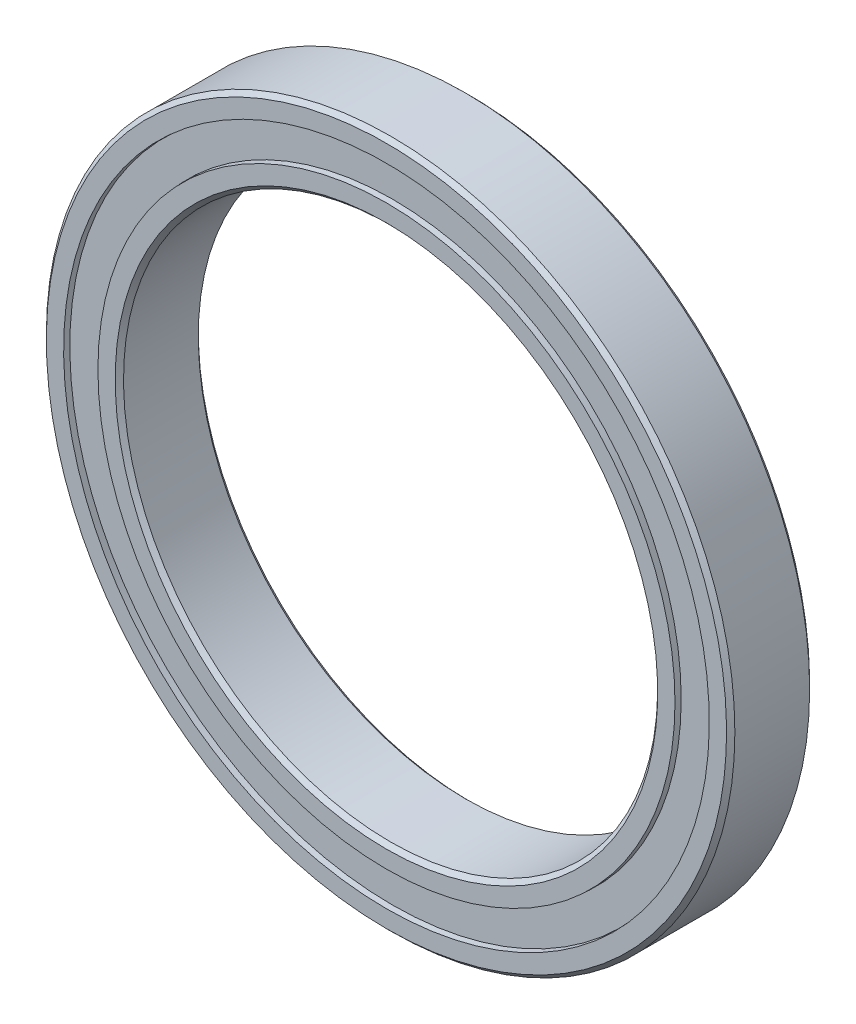
ISO-10303-21;
HEADER;
FILE_DESCRIPTION(('STEP AP214'),'2;1');
FILE_NAME('part.step','',(''),(''),'','','');
FILE_SCHEMA(('AUTOMOTIVE_DESIGN { 1 0 10303 214 1 1 1 1 }'));
ENDSEC;
DATA;
#1=APPLICATION_CONTEXT('core data for automotive mechanical design processes');
#2=APPLICATION_PROTOCOL_DEFINITION('international standard','automotive_design',2000,#1);
#3=PRODUCT_CONTEXT('',#1,'mechanical');
#4=PRODUCT('Part','Part','',(#3));
#5=PRODUCT_RELATED_PRODUCT_CATEGORY('part','',(#4));
#6=PRODUCT_DEFINITION_FORMATION('','',#4);
#7=PRODUCT_DEFINITION_CONTEXT('part definition',#1,'design');
#8=PRODUCT_DEFINITION('design','',#6,#7);
#9=PRODUCT_DEFINITION_SHAPE('','',#8);
#10=(LENGTH_UNIT() NAMED_UNIT(*) SI_UNIT(.MILLI.,.METRE.));
#11=(NAMED_UNIT(*) PLANE_ANGLE_UNIT() SI_UNIT($,.RADIAN.));
#12=(NAMED_UNIT(*) SI_UNIT($,.STERADIAN.) SOLID_ANGLE_UNIT());
#13=UNCERTAINTY_MEASURE_WITH_UNIT(LENGTH_MEASURE(1.E-05),#10,'distance_accuracy_value','');
#14=(GEOMETRIC_REPRESENTATION_CONTEXT(3) GLOBAL_UNCERTAINTY_ASSIGNED_CONTEXT((#13)) GLOBAL_UNIT_ASSIGNED_CONTEXT((#10,
#11,#12)) REPRESENTATION_CONTEXT('',''));
#15=CARTESIAN_POINT('',(0.,0.,0.));
#16=DIRECTION('',(0.,0.,1.));
#17=DIRECTION('',(1.,0.,0.));
#18=AXIS2_PLACEMENT_3D('',#15,#16,#17);
#19=CARTESIAN_POINT('',(7.58994574108045,24.6059997489932,0.));
#20=DIRECTION('',(0.,0.,1.));
#21=DIRECTION('',(0.294755174410891,0.955572805786145,0.));
#22=AXIS2_PLACEMENT_3D('',#19,#20,#21);
#23=SPHERICAL_SURFACE('',#22,2.12277479717142);
#24=CARTESIAN_POINT('',(7.58994574108045,24.6059997489932,2.12277479717142));
#25=VERTEX_POINT('',#24);
#26=VERTEX_LOOP('',#25);
#27=FACE_BOUND('',#26,.T.);
#28=ADVANCED_FACE('F44',(#27),#23,.T.);
#29=CLOSED_SHELL('',(#28));
#30=MANIFOLD_SOLID_BREP('B2',#29);
#31=CARTESIAN_POINT('',(14.505491495138,21.2756484386371,0.));
#32=DIRECTION('',(0.,0.,1.));
#33=DIRECTION('',(0.563320058063612,0.826238774316002,0.));
#34=AXIS2_PLACEMENT_3D('',#31,#32,#33);
#35=SPHERICAL_SURFACE('',#34,2.12277479717142);
#36=CARTESIAN_POINT('',(14.505491495138,21.2756484386371,2.12277479717142));
#37=VERTEX_POINT('',#36);
#38=VERTEX_LOOP('',#37);
#39=FACE_BOUND('',#38,.T.);
#40=ADVANCED_FACE('F61',(#39),#35,.T.);
#41=CLOSED_SHELL('',(#40));
#42=MANIFOLD_SOLID_BREP('B6',#41);
#43=CARTESIAN_POINT('',(20.1321606735516,16.0548623978626,0.));
#44=DIRECTION('',(0.,0.,1.));
#45=DIRECTION('',(0.781831482468022,0.623489801858743,0.));
#46=AXIS2_PLACEMENT_3D('',#43,#44,#45);
#47=SPHERICAL_SURFACE('',#46,2.12277479717142);
#48=CARTESIAN_POINT('',(20.1321606735516,16.0548623978626,2.12277479717142));
#49=VERTEX_POINT('',#48);
#50=VERTEX_LOOP('',#49);
#51=FACE_BOUND('',#50,.T.);
#52=ADVANCED_FACE('F78',(#51),#47,.T.);
#53=CLOSED_SHELL('',(#52));
#54=MANIFOLD_SOLID_BREP('B40',#53);
#55=CARTESIAN_POINT('',(23.9699990275882,9.40753137743494,0.));
#56=DIRECTION('',(0.,0.,1.));
#57=DIRECTION('',(0.9308737486442,0.365341024366405,0.));
#58=AXIS2_PLACEMENT_3D('',#55,#56,#57);
#59=SPHERICAL_SURFACE('',#58,2.12277479717142);
#60=CARTESIAN_POINT('',(23.9699990275882,9.40753137743494,2.12277479717142));
#61=VERTEX_POINT('',#60);
#62=VERTEX_LOOP('',#61);
#63=FACE_BOUND('',#62,.T.);
#64=ADVANCED_FACE('F95',(#63),#59,.T.);
#65=CLOSED_SHELL('',(#64));
#66=MANIFOLD_SOLID_BREP('B57',#65);
#67=CARTESIAN_POINT('',(25.6779977774154,1.9242999098507,0.));
#68=DIRECTION('',(0.,0.,1.));
#69=DIRECTION('',(0.997203797181179,0.074730093586435,0.));
#70=AXIS2_PLACEMENT_3D('',#67,#68,#69);
#71=SPHERICAL_SURFACE('',#70,2.12277479717142);
#72=CARTESIAN_POINT('',(25.6779977774154,1.9242999098507,2.12277479717141));
#73=VERTEX_POINT('',#72);
#74=VERTEX_LOOP('',#73);
#75=FACE_BOUND('',#74,.T.);
#76=ADVANCED_FACE('F114',(#75),#71,.T.);
#77=CLOSED_SHELL('',(#76));
#78=MANIFOLD_SOLID_BREP('B74',#77);
#79=CARTESIAN_POINT('',(25.104393738682,-5.72991404937483,0.));
#80=DIRECTION('',(0.,0.,1.));
#81=DIRECTION('',(0.974927912181826,-0.222520933956304,0.));
#82=AXIS2_PLACEMENT_3D('',#79,#80,#81);
#83=SPHERICAL_SURFACE('',#82,2.12277479717142);
#84=CARTESIAN_POINT('',(25.104393738682,-5.72991404937483,2.12277479717141));
#85=VERTEX_POINT('',#84);
#86=VERTEX_LOOP('',#85);
#87=FACE_BOUND('',#86,.T.);
#88=ADVANCED_FACE('F133',(#87),#83,.T.);
#89=CLOSED_SHELL('',(#88));
#90=MANIFOLD_SOLID_BREP('B91',#89);
#91=CARTESIAN_POINT('',(22.3001541474494,-12.8749999999998,0.));
#92=DIRECTION('',(0.,0.,1.));
#93=DIRECTION('',(0.866025403784443,-0.499999999999992,0.));
#94=AXIS2_PLACEMENT_3D('',#91,#92,#93);
#95=SPHERICAL_SURFACE('',#94,2.12277479717142);
#96=CARTESIAN_POINT('',(22.3001541474494,-12.8749999999998,2.12277479717141));
#97=VERTEX_POINT('',#96);
#98=VERTEX_LOOP('',#97);
#99=FACE_BOUND('',#98,.T.);
#100=ADVANCED_FACE('F152',(#99),#95,.T.);
#101=CLOSED_SHELL('',(#100));
#102=MANIFOLD_SOLID_BREP('B110',#101);
#103=CARTESIAN_POINT('',(17.5144479976013,-18.8760856996179,0.));
#104=DIRECTION('',(0.,0.,1.));
#105=DIRECTION('',(0.680172737770926,-0.73305187182982,0.));
#106=AXIS2_PLACEMENT_3D('',#103,#104,#105);
#107=SPHERICAL_SURFACE('',#106,2.12277479717142);
#108=CARTESIAN_POINT('',(17.5144479976013,-18.8760856996179,2.12277479717141));
#109=VERTEX_POINT('',#108);
#110=VERTEX_LOOP('',#109);
#111=FACE_BOUND('',#110,.T.);
#112=ADVANCED_FACE('F171',(#111),#107,.T.);
#113=CLOSED_SHELL('',(#112));
#114=MANIFOLD_SOLID_BREP('B129',#113);
#115=CARTESIAN_POINT('',(11.1725062822773,-23.1999483484872,0.));
#116=DIRECTION('',(0.,0.,1.));
#117=DIRECTION('',(0.433883739117565,-0.900968867902416,0.));
#118=AXIS2_PLACEMENT_3D('',#115,#116,#117);
#119=SPHERICAL_SURFACE('',#118,2.12277479717142);
#120=CARTESIAN_POINT('',(11.1725062822773,-23.1999483484872,2.12277479717141));
#121=VERTEX_POINT('',#120);
#122=VERTEX_LOOP('',#121);
#123=FACE_BOUND('',#122,.T.);
#124=ADVANCED_FACE('F190',(#123),#119,.T.);
#125=CLOSED_SHELL('',(#124));
#126=MANIFOLD_SOLID_BREP('B148',#125);
#127=CARTESIAN_POINT('',(3.83783835403668,-25.462393775297,0.));
#128=DIRECTION('',(0.,0.,1.));
#129=DIRECTION('',(0.149042266176182,-0.988830826225127,0.));
#130=AXIS2_PLACEMENT_3D('',#127,#128,#129);
#131=SPHERICAL_SURFACE('',#130,2.12277479717142);
#132=CARTESIAN_POINT('',(3.83783835403668,-25.462393775297,2.12277479717141));
#133=VERTEX_POINT('',#132);
#134=VERTEX_LOOP('',#133);
#135=FACE_BOUND('',#134,.T.);
#136=ADVANCED_FACE('F209',(#135),#131,.T.);
#137=CLOSED_SHELL('',(#136));
#138=MANIFOLD_SOLID_BREP('B167',#137);
#139=CARTESIAN_POINT('',(-3.83783835403632,-25.4623937752971,0.));
#140=DIRECTION('',(0.,0.,1.));
#141=DIRECTION('',(-0.149042266176168,-0.98883082622513,0.));
#142=AXIS2_PLACEMENT_3D('',#139,#140,#141);
#143=SPHERICAL_SURFACE('',#142,2.12277479717142);
#144=CARTESIAN_POINT('',(-3.83783835403632,-25.4623937752971,2.12277479717141));
#145=VERTEX_POINT('',#144);
#146=VERTEX_LOOP('',#145);
#147=FACE_BOUND('',#146,.T.);
#148=ADVANCED_FACE('F228',(#147),#143,.T.);
#149=CLOSED_SHELL('',(#148));
#150=MANIFOLD_SOLID_BREP('B186',#149);
#151=CARTESIAN_POINT('',(-11.172506282277,-23.1999483484874,0.));
#152=DIRECTION('',(0.,0.,1.));
#153=DIRECTION('',(-0.433883739117553,-0.900968867902422,0.));
#154=AXIS2_PLACEMENT_3D('',#151,#152,#153);
#155=SPHERICAL_SURFACE('',#154,2.12277479717142);
#156=CARTESIAN_POINT('',(-11.172506282277,-23.1999483484874,2.12277479717141));
#157=VERTEX_POINT('',#156);
#158=VERTEX_LOOP('',#157);
#159=FACE_BOUND('',#158,.T.);
#160=ADVANCED_FACE('F247',(#159),#155,.T.);
#161=CLOSED_SHELL('',(#160));
#162=MANIFOLD_SOLID_BREP('B205',#161);
#163=CARTESIAN_POINT('',(-17.5144479976011,-18.8760856996181,0.));
#164=DIRECTION('',(0.,0.,1.));
#165=DIRECTION('',(-0.680172737770915,-0.73305187182983,0.));
#166=AXIS2_PLACEMENT_3D('',#163,#164,#165);
#167=SPHERICAL_SURFACE('',#166,2.12277479717142);
#168=CARTESIAN_POINT('',(-17.5144479976011,-18.8760856996181,2.12277479717141));
#169=VERTEX_POINT('',#168);
#170=VERTEX_LOOP('',#169);
#171=FACE_BOUND('',#170,.T.);
#172=ADVANCED_FACE('F266',(#171),#167,.T.);
#173=CLOSED_SHELL('',(#172));
#174=MANIFOLD_SOLID_BREP('B224',#173);
#175=CARTESIAN_POINT('',(-22.3001541474492,-12.8750000000001,0.));
#176=DIRECTION('',(0.,0.,1.));
#177=DIRECTION('',(-0.866025403784436,-0.500000000000004,0.));
#178=AXIS2_PLACEMENT_3D('',#175,#176,#177);
#179=SPHERICAL_SURFACE('',#178,2.12277479717142);
#180=CARTESIAN_POINT('',(-22.3001541474492,-12.8750000000001,2.12277479717141));
#181=VERTEX_POINT('',#180);
#182=VERTEX_LOOP('',#181);
#183=FACE_BOUND('',#182,.T.);
#184=ADVANCED_FACE('F285',(#183),#179,.T.);
#185=CLOSED_SHELL('',(#184));
#186=MANIFOLD_SOLID_BREP('B243',#185);
#187=CARTESIAN_POINT('',(-25.1043937386819,-5.72991404937519,0.));
#188=DIRECTION('',(0.,0.,1.));
#189=DIRECTION('',(-0.974927912181823,-0.222520933956318,0.));
#190=AXIS2_PLACEMENT_3D('',#187,#188,#189);
#191=SPHERICAL_SURFACE('',#190,2.12277479717142);
#192=CARTESIAN_POINT('',(-25.1043937386819,-5.72991404937519,2.12277479717141));
#193=VERTEX_POINT('',#192);
#194=VERTEX_LOOP('',#193);
#195=FACE_BOUND('',#194,.T.);
#196=ADVANCED_FACE('F304',(#195),#191,.T.);
#197=CLOSED_SHELL('',(#196));
#198=MANIFOLD_SOLID_BREP('B262',#197);
#199=CARTESIAN_POINT('',(-25.6779977774154,1.92429990985034,0.));
#200=DIRECTION('',(0.,0.,1.));
#201=DIRECTION('',(-0.997203797181181,0.0747300935864209,0.));
#202=AXIS2_PLACEMENT_3D('',#199,#200,#201);
#203=SPHERICAL_SURFACE('',#202,2.12277479717142);
#204=CARTESIAN_POINT('',(-25.6779977774154,1.92429990985034,2.12277479717141));
#205=VERTEX_POINT('',#204);
#206=VERTEX_LOOP('',#205);
#207=FACE_BOUND('',#206,.T.);
#208=ADVANCED_FACE('F323',(#207),#203,.T.);
#209=CLOSED_SHELL('',(#208));
#210=MANIFOLD_SOLID_BREP('B281',#209);
#211=CARTESIAN_POINT('',(-23.9699990275883,9.40753137743461,0.));
#212=DIRECTION('',(0.,0.,1.));
#213=DIRECTION('',(-0.930873748644205,0.365341024366392,0.));
#214=AXIS2_PLACEMENT_3D('',#211,#212,#213);
#215=SPHERICAL_SURFACE('',#214,2.12277479717142);
#216=CARTESIAN_POINT('',(-23.9699990275883,9.40753137743461,2.12277479717142));
#217=VERTEX_POINT('',#216);
#218=VERTEX_LOOP('',#217);
#219=FACE_BOUND('',#218,.T.);
#220=ADVANCED_FACE('F342',(#219),#215,.T.);
#221=CLOSED_SHELL('',(#220));
#222=MANIFOLD_SOLID_BREP('B300',#221);
#223=CARTESIAN_POINT('',(-20.1321606735518,16.0548623978624,0.));
#224=DIRECTION('',(0.,0.,1.));
#225=DIRECTION('',(-0.781831482468031,0.623489801858732,0.));
#226=AXIS2_PLACEMENT_3D('',#223,#224,#225);
#227=SPHERICAL_SURFACE('',#226,2.12277479717142);
#228=CARTESIAN_POINT('',(-20.1321606735518,16.0548623978624,2.12277479717142));
#229=VERTEX_POINT('',#228);
#230=VERTEX_LOOP('',#229);
#231=FACE_BOUND('',#230,.T.);
#232=ADVANCED_FACE('F361',(#231),#227,.T.);
#233=CLOSED_SHELL('',(#232));
#234=MANIFOLD_SOLID_BREP('B319',#233);
#235=CARTESIAN_POINT('',(-14.5054914951383,21.2756484386368,0.));
#236=DIRECTION('',(0.,0.,1.));
#237=DIRECTION('',(-0.563320058063623,0.826238774315994,0.));
#238=AXIS2_PLACEMENT_3D('',#235,#236,#237);
#239=SPHERICAL_SURFACE('',#238,2.12277479717142);
#240=CARTESIAN_POINT('',(-14.5054914951383,21.2756484386368,2.12277479717142));
#241=VERTEX_POINT('',#240);
#242=VERTEX_LOOP('',#241);
#243=FACE_BOUND('',#242,.T.);
#244=ADVANCED_FACE('F380',(#243),#239,.T.);
#245=CLOSED_SHELL('',(#244));
#246=MANIFOLD_SOLID_BREP('B338',#245);
#247=CARTESIAN_POINT('',(-7.5899457410808,24.6059997489931,0.));
#248=DIRECTION('',(0.,0.,1.));
#249=DIRECTION('',(-0.294755174410905,0.955572805786141,0.));
#250=AXIS2_PLACEMENT_3D('',#247,#248,#249);
#251=SPHERICAL_SURFACE('',#250,2.12277479717142);
#252=CARTESIAN_POINT('',(-7.5899457410808,24.6059997489931,2.12277479717142));
#253=VERTEX_POINT('',#252);
#254=VERTEX_LOOP('',#253);
#255=FACE_BOUND('',#254,.T.);
#256=ADVANCED_FACE('F399',(#255),#251,.T.);
#257=CLOSED_SHELL('',(#256));
#258=MANIFOLD_SOLID_BREP('B357',#257);
#259=CARTESIAN_POINT('',(0.,25.75,0.));
#260=DIRECTION('',(0.,0.,1.));
#261=DIRECTION('',(0.,1.,0.));
#262=AXIS2_PLACEMENT_3D('',#259,#260,#261);
#263=SPHERICAL_SURFACE('',#262,2.12277479717142);
#264=CARTESIAN_POINT('',(0.,25.75,2.12277479717142));
#265=VERTEX_POINT('',#264);
#266=VERTEX_LOOP('',#265);
#267=FACE_BOUND('',#266,.T.);
#268=ADVANCED_FACE('F420',(#267),#263,.T.);
#269=CLOSED_SHELL('',(#268));
#270=MANIFOLD_SOLID_BREP('B376',#269);
#271=CARTESIAN_POINT('',(0.,24.3055555555556,3.50000000000003));
#272=DIRECTION('',(0.,0.,-1.));
#273=DIRECTION('',(0.,1.,0.));
#274=AXIS2_PLACEMENT_3D('',#271,#272,#273);
#275=PLANE('',#274);
#276=CARTESIAN_POINT('',(0.,0.,3.50000000000002));
#277=DIRECTION('',(0.,0.,1.));
#278=DIRECTION('',(0.,-1.,0.));
#279=AXIS2_PLACEMENT_3D('',#276,#277,#278);
#280=CIRCLE('',#279,22.85);
#281=CARTESIAN_POINT('',(0.,-22.85,3.50000000000002));
#282=VERTEX_POINT('',#281);
#283=EDGE_CURVE('E467',#282,#282,#280,.T.);
#284=ORIENTED_EDGE('',*,*,#283,.F.);
#285=EDGE_LOOP('',(#284));
#286=FACE_BOUND('',#285,.T.);
#287=CARTESIAN_POINT('',(0.,0.,3.50000000000003));
#288=DIRECTION('',(0.,0.,1.));
#289=DIRECTION('',(0.,-1.,0.));
#290=AXIS2_PLACEMENT_3D('',#287,#288,#289);
#291=CIRCLE('',#290,24.3055555555556);
#292=CARTESIAN_POINT('',(0.,-24.3055555555556,3.50000000000002));
#293=VERTEX_POINT('',#292);
#294=EDGE_CURVE('E419',#293,#293,#291,.T.);
#295=ORIENTED_EDGE('',*,*,#294,.T.);
#296=EDGE_LOOP('',(#295));
#297=FACE_BOUND('',#296,.T.);
#298=ADVANCED_FACE('F439',(#286,#297),#275,.F.);
#299=CARTESIAN_POINT('',(0.,0.,3.50000000000002));
#300=DIRECTION('',(0.,0.,1.));
#301=DIRECTION('',(0.,-1.,0.));
#302=AXIS2_PLACEMENT_3D('',#299,#300,#301);
#303=CYLINDRICAL_SURFACE('',#302,24.3055555555556);
#304=ORIENTED_EDGE('',*,*,#294,.F.);
#305=EDGE_LOOP('',(#304));
#306=FACE_BOUND('',#305,.T.);
#307=CARTESIAN_POINT('',(0.,0.,1.55555555555555));
#308=DIRECTION('',(0.,0.,1.));
#309=DIRECTION('',(0.,-1.,0.));
#310=AXIS2_PLACEMENT_3D('',#307,#308,#309);
#311=CIRCLE('',#310,24.3055555555556);
#312=CARTESIAN_POINT('',(0.,-24.3055555555556,1.55555555555555));
#313=VERTEX_POINT('',#312);
#314=EDGE_CURVE('E445',#313,#313,#311,.T.);
#315=ORIENTED_EDGE('',*,*,#314,.T.);
#316=EDGE_LOOP('',(#315));
#317=FACE_BOUND('',#316,.T.);
#318=ADVANCED_FACE('F474',(#306,#317),#303,.T.);
#319=CARTESIAN_POINT('',(0.,0.,0.));
#320=DIRECTION('',(0.,0.,1.));
#321=DIRECTION('',(0.,-1.,0.));
#322=AXIS2_PLACEMENT_3D('',#319,#320,#321);
#323=TOROIDAL_SURFACE('',#322,25.75,2.12277479717142);
#324=ORIENTED_EDGE('',*,*,#314,.F.);
#325=EDGE_LOOP('',(#324));
#326=FACE_BOUND('',#325,.T.);
#327=CARTESIAN_POINT('',(0.,0.,-1.55555555555555));
#328=DIRECTION('',(0.,0.,1.));
#329=DIRECTION('',(0.,-1.,0.));
#330=AXIS2_PLACEMENT_3D('',#327,#328,#329);
#331=CIRCLE('',#330,24.3055555555556);
#332=CARTESIAN_POINT('',(0.,-24.3055555555556,-1.55555555555556));
#333=VERTEX_POINT('',#332);
#334=EDGE_CURVE('E449',#333,#333,#331,.T.);
#335=ORIENTED_EDGE('',*,*,#334,.T.);
#336=EDGE_LOOP('',(#335));
#337=FACE_BOUND('',#336,.T.);
#338=ADVANCED_FACE('F478',(#326,#337),#323,.F.);
#339=CARTESIAN_POINT('',(0.,0.,3.50000000000002));
#340=DIRECTION('',(0.,0.,1.));
#341=DIRECTION('',(0.,-1.,0.));
#342=AXIS2_PLACEMENT_3D('',#339,#340,#341);
#343=CYLINDRICAL_SURFACE('',#342,24.3055555555556);
#344=ORIENTED_EDGE('',*,*,#334,.F.);
#345=EDGE_LOOP('',(#344));
#346=FACE_BOUND('',#345,.T.);
#347=CARTESIAN_POINT('',(0.,0.,-3.50000000000003));
#348=DIRECTION('',(0.,0.,1.));
#349=DIRECTION('',(0.,-1.,0.));
#350=AXIS2_PLACEMENT_3D('',#347,#348,#349);
#351=CIRCLE('',#350,24.3055555555556);
#352=CARTESIAN_POINT('',(0.,-24.3055555555556,-3.50000000000003));
#353=VERTEX_POINT('',#352);
#354=EDGE_CURVE('E453',#353,#353,#351,.T.);
#355=ORIENTED_EDGE('',*,*,#354,.T.);
#356=EDGE_LOOP('',(#355));
#357=FACE_BOUND('',#356,.T.);
#358=ADVANCED_FACE('F483',(#346,#357),#343,.T.);
#359=CARTESIAN_POINT('',(0.,22.85,-3.50000000000003));
#360=DIRECTION('',(0.,0.,1.));
#361=DIRECTION('',(0.,-1.,0.));
#362=AXIS2_PLACEMENT_3D('',#359,#360,#361);
#363=PLANE('',#362);
#364=ORIENTED_EDGE('',*,*,#354,.F.);
#365=EDGE_LOOP('',(#364));
#366=FACE_BOUND('',#365,.T.);
#367=CARTESIAN_POINT('',(0.,0.,-3.50000000000003));
#368=DIRECTION('',(0.,0.,1.));
#369=DIRECTION('',(0.,-1.,0.));
#370=AXIS2_PLACEMENT_3D('',#367,#368,#369);
#371=CIRCLE('',#370,22.85);
#372=CARTESIAN_POINT('',(0.,-22.85,-3.50000000000004));
#373=VERTEX_POINT('',#372);
#374=EDGE_CURVE('E458',#373,#373,#371,.T.);
#375=ORIENTED_EDGE('',*,*,#374,.T.);
#376=EDGE_LOOP('',(#375));
#377=FACE_BOUND('',#376,.T.);
#378=ADVANCED_FACE('F489',(#366,#377),#363,.F.);
#379=CARTESIAN_POINT('',(0.,0.,-3.15000000000003));
#380=DIRECTION('',(0.,0.,-1.));
#381=DIRECTION('',(0.,1.,0.));
#382=AXIS2_PLACEMENT_3D('',#379,#380,#381);
#383=CONICAL_SURFACE('',#382,22.5,0.785398163397427);
#384=ORIENTED_EDGE('',*,*,#374,.F.);
#385=EDGE_LOOP('',(#384));
#386=FACE_BOUND('',#385,.T.);
#387=CARTESIAN_POINT('',(0.,0.,-3.15000000000003));
#388=DIRECTION('',(0.,0.,1.));
#389=DIRECTION('',(0.,-1.,0.));
#390=AXIS2_PLACEMENT_3D('',#387,#388,#389);
#391=CIRCLE('',#390,22.5);
#392=CARTESIAN_POINT('',(0.,-22.5,-3.15000000000003));
#393=VERTEX_POINT('',#392);
#394=EDGE_CURVE('E461',#393,#393,#391,.T.);
#395=ORIENTED_EDGE('',*,*,#394,.T.);
#396=EDGE_LOOP('',(#395));
#397=FACE_BOUND('',#396,.T.);
#398=ADVANCED_FACE('F493',(#386,#397),#383,.F.);
#399=CARTESIAN_POINT('',(0.,0.,3.50000000000002));
#400=DIRECTION('',(0.,0.,1.));
#401=DIRECTION('',(0.,-1.,0.));
#402=AXIS2_PLACEMENT_3D('',#399,#400,#401);
#403=CYLINDRICAL_SURFACE('',#402,22.5);
#404=ORIENTED_EDGE('',*,*,#394,.F.);
#405=EDGE_LOOP('',(#404));
#406=FACE_BOUND('',#405,.T.);
#407=CARTESIAN_POINT('',(0.,0.,3.15000000000003));
#408=DIRECTION('',(0.,0.,1.));
#409=DIRECTION('',(0.,-1.,0.));
#410=AXIS2_PLACEMENT_3D('',#407,#408,#409);
#411=CIRCLE('',#410,22.5);
#412=CARTESIAN_POINT('',(0.,-22.5,3.15000000000003));
#413=VERTEX_POINT('',#412);
#414=EDGE_CURVE('E464',#413,#413,#411,.T.);
#415=ORIENTED_EDGE('',*,*,#414,.T.);
#416=EDGE_LOOP('',(#415));
#417=FACE_BOUND('',#416,.T.);
#418=ADVANCED_FACE('F497',(#406,#417),#403,.F.);
#419=CARTESIAN_POINT('',(0.,0.,3.50000000000002));
#420=DIRECTION('',(0.,0.,1.));
#421=DIRECTION('',(0.,-1.,0.));
#422=AXIS2_PLACEMENT_3D('',#419,#420,#421);
#423=CONICAL_SURFACE('',#422,22.85,0.785398163397487);
#424=ORIENTED_EDGE('',*,*,#414,.F.);
#425=EDGE_LOOP('',(#424));
#426=FACE_BOUND('',#425,.T.);
#427=ORIENTED_EDGE('',*,*,#283,.T.);
#428=EDGE_LOOP('',(#427));
#429=FACE_BOUND('',#428,.T.);
#430=ADVANCED_FACE('F471',(#426,#429),#423,.F.);
#431=CLOSED_SHELL('',(#298,#318,#338,#358,#378,#398,#418,#430));
#432=MANIFOLD_SOLID_BREP('B395',#431);
#433=CARTESIAN_POINT('',(0.,24.3309555555556,-2.62088739858573));
#434=DIRECTION('',(0.,0.,-1.));
#435=DIRECTION('',(0.,1.,0.));
#436=AXIS2_PLACEMENT_3D('',#433,#434,#435);
#437=PLANE('',#436);
#438=CARTESIAN_POINT('',(0.,0.,-2.62088739858573));
#439=DIRECTION('',(0.,0.,1.));
#440=DIRECTION('',(0.,-1.,0.));
#441=AXIS2_PLACEMENT_3D('',#438,#439,#440);
#442=CIRCLE('',#441,24.3309555555556);
#443=CARTESIAN_POINT('',(0.,-24.3309555555556,-2.62088739858573));
#444=VERTEX_POINT('',#443);
#445=EDGE_CURVE('E567',#444,#444,#442,.T.);
#446=ORIENTED_EDGE('',*,*,#445,.F.);
#447=EDGE_LOOP('',(#446));
#448=FACE_BOUND('',#447,.T.);
#449=CARTESIAN_POINT('',(0.,0.,-2.62088739858573));
#450=DIRECTION('',(0.,0.,1.));
#451=DIRECTION('',(0.,-1.,0.));
#452=AXIS2_PLACEMENT_3D('',#449,#450,#451);
#453=CIRCLE('',#452,27.1690444444444);
#454=CARTESIAN_POINT('',(0.,-27.1690444444444,-2.62088739858573));
#455=VERTEX_POINT('',#454);
#456=EDGE_CURVE('E438',#455,#455,#453,.T.);
#457=ORIENTED_EDGE('',*,*,#456,.T.);
#458=EDGE_LOOP('',(#457));
#459=FACE_BOUND('',#458,.T.);
#460=ADVANCED_FACE('F553',(#448,#459),#437,.F.);
#461=CARTESIAN_POINT('',(0.,0.,3.50000000000002));
#462=DIRECTION('',(0.,0.,1.));
#463=DIRECTION('',(0.,-1.,0.));
#464=AXIS2_PLACEMENT_3D('',#461,#462,#463);
#465=CYLINDRICAL_SURFACE('',#464,27.1690444444444);
#466=ORIENTED_EDGE('',*,*,#456,.F.);
#467=EDGE_LOOP('',(#466));
#468=FACE_BOUND('',#467,.T.);
#469=CARTESIAN_POINT('',(0.,0.,-3.00188739858573));
#470=DIRECTION('',(0.,0.,1.));
#471=DIRECTION('',(0.,-1.,0.));
#472=AXIS2_PLACEMENT_3D('',#469,#470,#471);
#473=CIRCLE('',#472,27.1690444444444);
#474=CARTESIAN_POINT('',(0.,-27.1690444444444,-3.00188739858573));
#475=VERTEX_POINT('',#474);
#476=EDGE_CURVE('E559',#475,#475,#473,.T.);
#477=ORIENTED_EDGE('',*,*,#476,.T.);
#478=EDGE_LOOP('',(#477));
#479=FACE_BOUND('',#478,.T.);
#480=ADVANCED_FACE('F576',(#468,#479),#465,.T.);
#481=CARTESIAN_POINT('',(0.,24.3309555555556,-3.00188739858573));
#482=DIRECTION('',(0.,0.,1.));
#483=DIRECTION('',(0.,-1.,0.));
#484=AXIS2_PLACEMENT_3D('',#481,#482,#483);
#485=PLANE('',#484);
#486=ORIENTED_EDGE('',*,*,#476,.F.);
#487=EDGE_LOOP('',(#486));
#488=FACE_BOUND('',#487,.T.);
#489=CARTESIAN_POINT('',(0.,0.,-3.00188739858573));
#490=DIRECTION('',(0.,0.,1.));
#491=DIRECTION('',(0.,-1.,0.));
#492=AXIS2_PLACEMENT_3D('',#489,#490,#491);
#493=CIRCLE('',#492,24.3309555555556);
#494=CARTESIAN_POINT('',(0.,-24.3309555555556,-3.00188739858573));
#495=VERTEX_POINT('',#494);
#496=EDGE_CURVE('E563',#495,#495,#493,.T.);
#497=ORIENTED_EDGE('',*,*,#496,.T.);
#498=EDGE_LOOP('',(#497));
#499=FACE_BOUND('',#498,.T.);
#500=ADVANCED_FACE('F580',(#488,#499),#485,.F.);
#501=CARTESIAN_POINT('',(0.,0.,3.50000000000002));
#502=DIRECTION('',(0.,0.,1.));
#503=DIRECTION('',(0.,-1.,0.));
#504=AXIS2_PLACEMENT_3D('',#501,#502,#503);
#505=CYLINDRICAL_SURFACE('',#504,24.3309555555556);
#506=ORIENTED_EDGE('',*,*,#496,.F.);
#507=EDGE_LOOP('',(#506));
#508=FACE_BOUND('',#507,.T.);
#509=ORIENTED_EDGE('',*,*,#445,.T.);
#510=EDGE_LOOP('',(#509));
#511=FACE_BOUND('',#510,.T.);
#512=ADVANCED_FACE('F573',(#508,#511),#505,.F.);
#513=CLOSED_SHELL('',(#460,#480,#500,#512));
#514=MANIFOLD_SOLID_BREP('B414',#513);
#515=CARTESIAN_POINT('',(0.,24.3309555555556,3.00188739858572));
#516=DIRECTION('',(0.,0.,-1.));
#517=DIRECTION('',(0.,1.,0.));
#518=AXIS2_PLACEMENT_3D('',#515,#516,#517);
#519=PLANE('',#518);
#520=CARTESIAN_POINT('',(0.,0.,3.00188739858571));
#521=DIRECTION('',(0.,0.,1.));
#522=DIRECTION('',(0.,-1.,0.));
#523=AXIS2_PLACEMENT_3D('',#520,#521,#522);
#524=CIRCLE('',#523,24.3309555555556);
#525=CARTESIAN_POINT('',(0.,-24.3309555555556,3.00188739858571));
#526=VERTEX_POINT('',#525);
#527=EDGE_CURVE('E552',#526,#526,#524,.T.);
#528=ORIENTED_EDGE('',*,*,#527,.F.);
#529=EDGE_LOOP('',(#528));
#530=FACE_BOUND('',#529,.T.);
#531=CARTESIAN_POINT('',(0.,0.,3.00188739858571));
#532=DIRECTION('',(0.,0.,1.));
#533=DIRECTION('',(0.,-1.,0.));
#534=AXIS2_PLACEMENT_3D('',#531,#532,#533);
#535=CIRCLE('',#534,27.1690444444444);
#536=CARTESIAN_POINT('',(0.,-27.1690444444444,3.00188739858571));
#537=VERTEX_POINT('',#536);
#538=EDGE_CURVE('E628',#537,#537,#535,.T.);
#539=ORIENTED_EDGE('',*,*,#538,.T.);
#540=EDGE_LOOP('',(#539));
#541=FACE_BOUND('',#540,.T.);
#542=ADVANCED_FACE('F614',(#530,#541),#519,.F.);
#543=CARTESIAN_POINT('',(0.,0.,3.50000000000002));
#544=DIRECTION('',(0.,0.,1.));
#545=DIRECTION('',(0.,-1.,0.));
#546=AXIS2_PLACEMENT_3D('',#543,#544,#545);
#547=CYLINDRICAL_SURFACE('',#546,24.3309555555556);
#548=CARTESIAN_POINT('',(0.,0.,2.62088739858571));
#549=DIRECTION('',(0.,0.,1.));
#550=DIRECTION('',(0.,-1.,0.));
#551=AXIS2_PLACEMENT_3D('',#548,#549,#550);
#552=CIRCLE('',#551,24.3309555555556);
#553=CARTESIAN_POINT('',(0.,-24.3309555555556,2.62088739858571));
#554=VERTEX_POINT('',#553);
#555=EDGE_CURVE('E620',#554,#554,#552,.T.);
#556=ORIENTED_EDGE('',*,*,#555,.F.);
#557=EDGE_LOOP('',(#556));
#558=FACE_BOUND('',#557,.T.);
#559=ORIENTED_EDGE('',*,*,#527,.T.);
#560=EDGE_LOOP('',(#559));
#561=FACE_BOUND('',#560,.T.);
#562=ADVANCED_FACE('F643',(#558,#561),#547,.F.);
#563=CARTESIAN_POINT('',(0.,24.3309555555556,2.62088739858572));
#564=DIRECTION('',(0.,0.,1.));
#565=DIRECTION('',(0.,-1.,0.));
#566=AXIS2_PLACEMENT_3D('',#563,#564,#565);
#567=PLANE('',#566);
#568=CARTESIAN_POINT('',(0.,0.,2.62088739858571));
#569=DIRECTION('',(0.,0.,1.));
#570=DIRECTION('',(0.,-1.,0.));
#571=AXIS2_PLACEMENT_3D('',#568,#569,#570);
#572=CIRCLE('',#571,27.1690444444444);
#573=CARTESIAN_POINT('',(0.,-27.1690444444444,2.62088739858571));
#574=VERTEX_POINT('',#573);
#575=EDGE_CURVE('E624',#574,#574,#572,.T.);
#576=ORIENTED_EDGE('',*,*,#575,.F.);
#577=EDGE_LOOP('',(#576));
#578=FACE_BOUND('',#577,.T.);
#579=ORIENTED_EDGE('',*,*,#555,.T.);
#580=EDGE_LOOP('',(#579));
#581=FACE_BOUND('',#580,.T.);
#582=ADVANCED_FACE('F638',(#578,#581),#567,.F.);
#583=CARTESIAN_POINT('',(0.,0.,3.50000000000002));
#584=DIRECTION('',(0.,0.,1.));
#585=DIRECTION('',(0.,-1.,0.));
#586=AXIS2_PLACEMENT_3D('',#583,#584,#585);
#587=CYLINDRICAL_SURFACE('',#586,27.1690444444444);
#588=ORIENTED_EDGE('',*,*,#538,.F.);
#589=EDGE_LOOP('',(#588));
#590=FACE_BOUND('',#589,.T.);
#591=ORIENTED_EDGE('',*,*,#575,.T.);
#592=EDGE_LOOP('',(#591));
#593=FACE_BOUND('',#592,.T.);
#594=ADVANCED_FACE('F635',(#590,#593),#587,.T.);
#595=CLOSED_SHELL('',(#542,#562,#582,#594));
#596=MANIFOLD_SOLID_BREP('B433',#595);
#597=CARTESIAN_POINT('',(0.,0.,3.15000000000001));
#598=DIRECTION('',(0.,0.,-1.));
#599=DIRECTION('',(0.,1.,0.));
#600=AXIS2_PLACEMENT_3D('',#597,#598,#599);
#601=CONICAL_SURFACE('',#600,29.,0.785398163397453);
#602=CARTESIAN_POINT('',(0.,0.,3.50000000000001));
#603=DIRECTION('',(0.,0.,1.));
#604=DIRECTION('',(0.,-1.,0.));
#605=AXIS2_PLACEMENT_3D('',#602,#603,#604);
#606=CIRCLE('',#605,28.65);
#607=CARTESIAN_POINT('',(0.,-28.65,3.50000000000001));
#608=VERTEX_POINT('',#607);
#609=EDGE_CURVE('E696',#608,#608,#606,.T.);
#610=ORIENTED_EDGE('',*,*,#609,.F.);
#611=EDGE_LOOP('',(#610));
#612=FACE_BOUND('',#611,.T.);
#613=CARTESIAN_POINT('',(0.,0.,3.15000000000001));
#614=DIRECTION('',(0.,0.,1.));
#615=DIRECTION('',(0.,-1.,0.));
#616=AXIS2_PLACEMENT_3D('',#613,#614,#615);
#617=CIRCLE('',#616,29.);
#618=CARTESIAN_POINT('',(0.,-29.,3.15000000000001));
#619=VERTEX_POINT('',#618);
#620=EDGE_CURVE('E613',#619,#619,#617,.T.);
#621=ORIENTED_EDGE('',*,*,#620,.T.);
#622=EDGE_LOOP('',(#621));
#623=FACE_BOUND('',#622,.T.);
#624=ADVANCED_FACE('F668',(#612,#623),#601,.T.);
#625=CARTESIAN_POINT('',(0.,0.,3.50000000000002));
#626=DIRECTION('',(0.,0.,1.));
#627=DIRECTION('',(0.,-1.,0.));
#628=AXIS2_PLACEMENT_3D('',#625,#626,#627);
#629=CYLINDRICAL_SURFACE('',#628,29.);
#630=ORIENTED_EDGE('',*,*,#620,.F.);
#631=EDGE_LOOP('',(#630));
#632=FACE_BOUND('',#631,.T.);
#633=CARTESIAN_POINT('',(0.,0.,-3.15000000000003));
#634=DIRECTION('',(0.,0.,1.));
#635=DIRECTION('',(0.,-1.,0.));
#636=AXIS2_PLACEMENT_3D('',#633,#634,#635);
#637=CIRCLE('',#636,29.);
#638=CARTESIAN_POINT('',(0.,-29.,-3.15000000000003));
#639=VERTEX_POINT('',#638);
#640=EDGE_CURVE('E674',#639,#639,#637,.T.);
#641=ORIENTED_EDGE('',*,*,#640,.T.);
#642=EDGE_LOOP('',(#641));
#643=FACE_BOUND('',#642,.T.);
#644=ADVANCED_FACE('F703',(#632,#643),#629,.T.);
#645=CARTESIAN_POINT('',(0.,0.,-3.50000000000003));
#646=DIRECTION('',(0.,0.,1.));
#647=DIRECTION('',(0.,-1.,0.));
#648=AXIS2_PLACEMENT_3D('',#645,#646,#647);
#649=CONICAL_SURFACE('',#648,28.65,0.785398163397452);
#650=ORIENTED_EDGE('',*,*,#640,.F.);
#651=EDGE_LOOP('',(#650));
#652=FACE_BOUND('',#651,.T.);
#653=CARTESIAN_POINT('',(0.,0.,-3.50000000000003));
#654=DIRECTION('',(0.,0.,1.));
#655=DIRECTION('',(0.,-1.,0.));
#656=AXIS2_PLACEMENT_3D('',#653,#654,#655);
#657=CIRCLE('',#656,28.65);
#658=CARTESIAN_POINT('',(0.,-28.65,-3.50000000000003));
#659=VERTEX_POINT('',#658);
#660=EDGE_CURVE('E678',#659,#659,#657,.T.);
#661=ORIENTED_EDGE('',*,*,#660,.T.);
#662=EDGE_LOOP('',(#661));
#663=FACE_BOUND('',#662,.T.);
#664=ADVANCED_FACE('F707',(#652,#663),#649,.T.);
#665=CARTESIAN_POINT('',(0.,28.65,-3.50000000000002));
#666=DIRECTION('',(0.,0.,1.));
#667=DIRECTION('',(0.,-1.,0.));
#668=AXIS2_PLACEMENT_3D('',#665,#666,#667);
#669=PLANE('',#668);
#670=ORIENTED_EDGE('',*,*,#660,.F.);
#671=EDGE_LOOP('',(#670));
#672=FACE_BOUND('',#671,.T.);
#673=CARTESIAN_POINT('',(0.,0.,-3.50000000000003));
#674=DIRECTION('',(0.,0.,1.));
#675=DIRECTION('',(0.,-1.,0.));
#676=AXIS2_PLACEMENT_3D('',#673,#674,#675);
#677=CIRCLE('',#676,27.1944444444444);
#678=CARTESIAN_POINT('',(0.,-27.1944444444444,-3.50000000000003));
#679=VERTEX_POINT('',#678);
#680=EDGE_CURVE('E682',#679,#679,#677,.T.);
#681=ORIENTED_EDGE('',*,*,#680,.T.);
#682=EDGE_LOOP('',(#681));
#683=FACE_BOUND('',#682,.T.);
#684=ADVANCED_FACE('F712',(#672,#683),#669,.F.);
#685=CARTESIAN_POINT('',(0.,0.,3.50000000000002));
#686=DIRECTION('',(0.,0.,1.));
#687=DIRECTION('',(0.,-1.,0.));
#688=AXIS2_PLACEMENT_3D('',#685,#686,#687);
#689=CYLINDRICAL_SURFACE('',#688,27.1944444444444);
#690=ORIENTED_EDGE('',*,*,#680,.F.);
#691=EDGE_LOOP('',(#690));
#692=FACE_BOUND('',#691,.T.);
#693=CARTESIAN_POINT('',(0.,0.,-1.55555555555556));
#694=DIRECTION('',(0.,0.,1.));
#695=DIRECTION('',(0.,-1.,0.));
#696=AXIS2_PLACEMENT_3D('',#693,#694,#695);
#697=CIRCLE('',#696,27.1944444444444);
#698=CARTESIAN_POINT('',(0.,-27.1944444444444,-1.55555555555557));
#699=VERTEX_POINT('',#698);
#700=EDGE_CURVE('E687',#699,#699,#697,.T.);
#701=ORIENTED_EDGE('',*,*,#700,.T.);
#702=EDGE_LOOP('',(#701));
#703=FACE_BOUND('',#702,.T.);
#704=ADVANCED_FACE('F718',(#692,#703),#689,.F.);
#705=CARTESIAN_POINT('',(0.,0.,0.));
#706=DIRECTION('',(0.,0.,1.));
#707=DIRECTION('',(0.,-1.,0.));
#708=AXIS2_PLACEMENT_3D('',#705,#706,#707);
#709=TOROIDAL_SURFACE('',#708,25.75,2.12277479717142);
#710=ORIENTED_EDGE('',*,*,#700,.F.);
#711=EDGE_LOOP('',(#710));
#712=FACE_BOUND('',#711,.T.);
#713=CARTESIAN_POINT('',(0.,0.,1.55555555555555));
#714=DIRECTION('',(0.,0.,1.));
#715=DIRECTION('',(0.,-1.,0.));
#716=AXIS2_PLACEMENT_3D('',#713,#714,#715);
#717=CIRCLE('',#716,27.1944444444444);
#718=CARTESIAN_POINT('',(0.,-27.1944444444444,1.55555555555555));
#719=VERTEX_POINT('',#718);
#720=EDGE_CURVE('E690',#719,#719,#717,.T.);
#721=ORIENTED_EDGE('',*,*,#720,.T.);
#722=EDGE_LOOP('',(#721));
#723=FACE_BOUND('',#722,.T.);
#724=ADVANCED_FACE('F722',(#712,#723),#709,.F.);
#725=CARTESIAN_POINT('',(0.,0.,3.50000000000002));
#726=DIRECTION('',(0.,0.,1.));
#727=DIRECTION('',(0.,-1.,0.));
#728=AXIS2_PLACEMENT_3D('',#725,#726,#727);
#729=CYLINDRICAL_SURFACE('',#728,27.1944444444444);
#730=ORIENTED_EDGE('',*,*,#720,.F.);
#731=EDGE_LOOP('',(#730));
#732=FACE_BOUND('',#731,.T.);
#733=CARTESIAN_POINT('',(0.,0.,3.50000000000001));
#734=DIRECTION('',(0.,0.,1.));
#735=DIRECTION('',(0.,-1.,0.));
#736=AXIS2_PLACEMENT_3D('',#733,#734,#735);
#737=CIRCLE('',#736,27.1944444444444);
#738=CARTESIAN_POINT('',(0.,-27.1944444444444,3.50000000000001));
#739=VERTEX_POINT('',#738);
#740=EDGE_CURVE('E693',#739,#739,#737,.T.);
#741=ORIENTED_EDGE('',*,*,#740,.T.);
#742=EDGE_LOOP('',(#741));
#743=FACE_BOUND('',#742,.T.);
#744=ADVANCED_FACE('F726',(#732,#743),#729,.F.);
#745=CARTESIAN_POINT('',(0.,28.65,3.50000000000002));
#746=DIRECTION('',(0.,0.,-1.));
#747=DIRECTION('',(0.,1.,0.));
#748=AXIS2_PLACEMENT_3D('',#745,#746,#747);
#749=PLANE('',#748);
#750=ORIENTED_EDGE('',*,*,#740,.F.);
#751=EDGE_LOOP('',(#750));
#752=FACE_BOUND('',#751,.T.);
#753=ORIENTED_EDGE('',*,*,#609,.T.);
#754=EDGE_LOOP('',(#753));
#755=FACE_BOUND('',#754,.T.);
#756=ADVANCED_FACE('F700',(#752,#755),#749,.F.);
#757=CLOSED_SHELL('',(#624,#644,#664,#684,#704,#724,#744,#756));
#758=MANIFOLD_SOLID_BREP('B547',#757);
#759=ADVANCED_BREP_SHAPE_REPRESENTATION('',(#18,#30,#42,#54,#66,#78,#90,#102,#114,#126,#138,
#150,#162,#174,#186,#198,#210,#222,#234,#246,#258,#270,#432,#514,#596,#758),#14);
#760=SHAPE_DEFINITION_REPRESENTATION(#9,#759);
ENDSEC;
END-ISO-10303-21;
